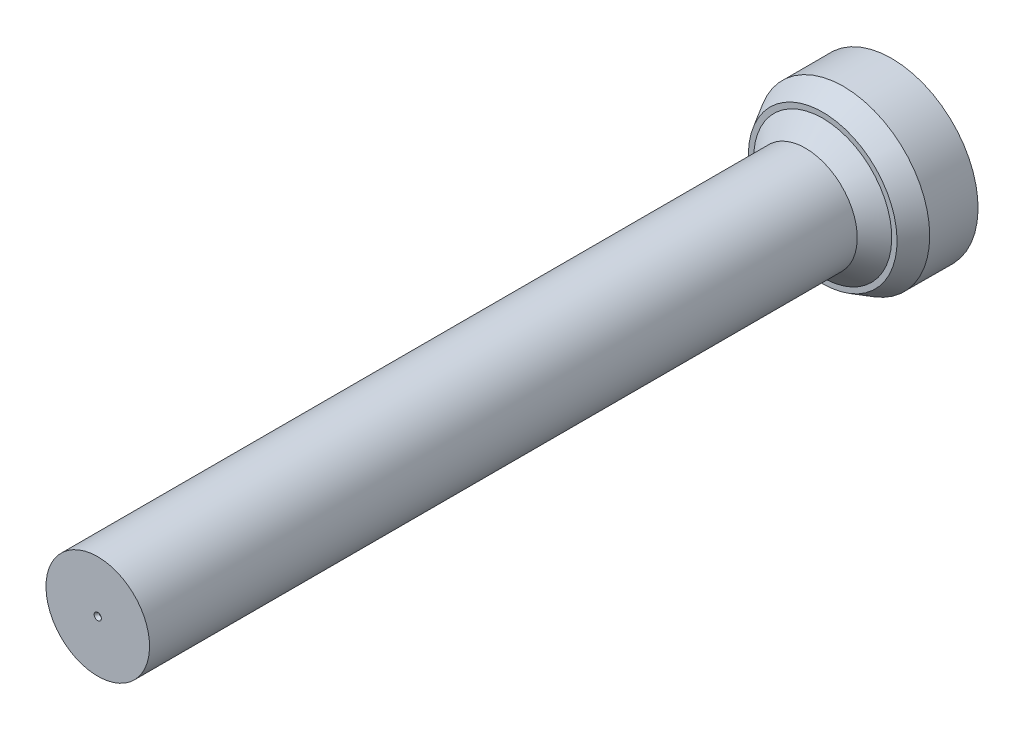
ISO-10303-21;
HEADER;
FILE_DESCRIPTION(('STEP AP214'),'2;1');
FILE_NAME('part.step','',(''),(''),'','','');
FILE_SCHEMA(('AUTOMOTIVE_DESIGN { 1 0 10303 214 1 1 1 1 }'));
ENDSEC;
DATA;
#1=APPLICATION_CONTEXT('core data for automotive mechanical design processes');
#2=APPLICATION_PROTOCOL_DEFINITION('international standard','automotive_design',2000,#1);
#3=PRODUCT_CONTEXT('',#1,'mechanical');
#4=PRODUCT('Part','Part','',(#3));
#5=PRODUCT_RELATED_PRODUCT_CATEGORY('part','',(#4));
#6=PRODUCT_DEFINITION_FORMATION('','',#4);
#7=PRODUCT_DEFINITION_CONTEXT('part definition',#1,'design');
#8=PRODUCT_DEFINITION('design','',#6,#7);
#9=PRODUCT_DEFINITION_SHAPE('','',#8);
#10=(LENGTH_UNIT() NAMED_UNIT(*) SI_UNIT(.MILLI.,.METRE.));
#11=(NAMED_UNIT(*) PLANE_ANGLE_UNIT() SI_UNIT($,.RADIAN.));
#12=(NAMED_UNIT(*) SI_UNIT($,.STERADIAN.) SOLID_ANGLE_UNIT());
#13=UNCERTAINTY_MEASURE_WITH_UNIT(LENGTH_MEASURE(1.E-05),#10,'distance_accuracy_value','');
#14=(GEOMETRIC_REPRESENTATION_CONTEXT(3) GLOBAL_UNCERTAINTY_ASSIGNED_CONTEXT((#13)) GLOBAL_UNIT_ASSIGNED_CONTEXT((#10,
#11,#12)) REPRESENTATION_CONTEXT('',''));
#15=CARTESIAN_POINT('',(0.,0.,0.));
#16=DIRECTION('',(0.,0.,1.));
#17=DIRECTION('',(1.,0.,0.));
#18=AXIS2_PLACEMENT_3D('',#15,#16,#17);
#19=CARTESIAN_POINT('',(0.,15.,115.));
#20=DIRECTION('',(0.,0.,1.));
#21=DIRECTION('',(0.,-1.,0.));
#22=AXIS2_PLACEMENT_3D('',#19,#20,#21);
#23=PLANE('',#22);
#24=CARTESIAN_POINT('',(0.,0.,115.));
#25=DIRECTION('',(0.,0.,-1.));
#26=DIRECTION('',(0.,1.,0.));
#27=AXIS2_PLACEMENT_3D('',#24,#25,#26);
#28=CIRCLE('',#27,15.);
#29=CARTESIAN_POINT('',(0.,15.,115.));
#30=VERTEX_POINT('',#29);
#31=EDGE_CURVE('E102',#30,#30,#28,.T.);
#32=ORIENTED_EDGE('',*,*,#31,.F.);
#33=EDGE_LOOP('',(#32));
#34=FACE_BOUND('',#33,.T.);
#35=CARTESIAN_POINT('',(0.,0.,115.));
#36=DIRECTION('',(0.,0.,1.));
#37=DIRECTION('',(1.,0.,0.));
#38=AXIS2_PLACEMENT_3D('',#35,#36,#37);
#39=CIRCLE('',#38,1.06);
#40=CARTESIAN_POINT('',(1.06,0.,115.));
#41=VERTEX_POINT('',#40);
#42=EDGE_CURVE('E108',#41,#41,#39,.T.);
#43=ORIENTED_EDGE('',*,*,#42,.F.);
#44=EDGE_LOOP('',(#43));
#45=FACE_BOUND('',#44,.T.);
#46=ADVANCED_FACE('F37',(#34,#45),#23,.T.);
#47=CARTESIAN_POINT('',(0.,0.,-115.));
#48=DIRECTION('',(0.,0.,-1.));
#49=DIRECTION('',(0.,1.,0.));
#50=AXIS2_PLACEMENT_3D('',#47,#48,#49);
#51=PLANE('',#50);
#52=CARTESIAN_POINT('',(0.,0.,-115.));
#53=DIRECTION('',(0.,0.,-1.));
#54=DIRECTION('',(0.,1.,0.));
#55=AXIS2_PLACEMENT_3D('',#52,#53,#54);
#56=CIRCLE('',#55,25.);
#57=CARTESIAN_POINT('',(0.,25.,-115.));
#58=VERTEX_POINT('',#57);
#59=EDGE_CURVE('E93',#58,#58,#56,.T.);
#60=ORIENTED_EDGE('',*,*,#59,.T.);
#61=EDGE_LOOP('',(#60));
#62=FACE_BOUND('',#61,.T.);
#63=ADVANCED_FACE('F60',(#62),#51,.T.);
#64=CARTESIAN_POINT('',(0.,0.,-115.));
#65=DIRECTION('',(0.,0.,-1.));
#66=DIRECTION('',(0.,1.,0.));
#67=AXIS2_PLACEMENT_3D('',#64,#65,#66);
#68=CYLINDRICAL_SURFACE('',#67,25.);
#69=CARTESIAN_POINT('',(0.,0.,-101.));
#70=DIRECTION('',(0.,0.,1.));
#71=DIRECTION('',(0.,-1.,0.));
#72=AXIS2_PLACEMENT_3D('',#69,#70,#71);
#73=CIRCLE('',#72,25.);
#74=CARTESIAN_POINT('',(0.,-24.9999999999999,-101.));
#75=VERTEX_POINT('',#74);
#76=EDGE_CURVE('E44',#75,#75,#73,.F.);
#77=ORIENTED_EDGE('',*,*,#76,.T.);
#78=EDGE_LOOP('',(#77));
#79=FACE_BOUND('',#78,.T.);
#80=ORIENTED_EDGE('',*,*,#59,.F.);
#81=EDGE_LOOP('',(#80));
#82=FACE_BOUND('',#81,.T.);
#83=ADVANCED_FACE('F66',(#79,#82),#68,.T.);
#84=CARTESIAN_POINT('',(0.,25.,-95.));
#85=DIRECTION('',(0.,0.,1.));
#86=DIRECTION('',(0.,-1.,0.));
#87=AXIS2_PLACEMENT_3D('',#84,#85,#86);
#88=PLANE('',#87);
#89=CARTESIAN_POINT('',(0.,0.,-95.));
#90=DIRECTION('',(0.,0.,1.));
#91=DIRECTION('',(0.,-1.,0.));
#92=AXIS2_PLACEMENT_3D('',#89,#90,#91);
#93=CIRCLE('',#92,21.5358983848623);
#94=CARTESIAN_POINT('',(0.,-21.5358983848622,-95.));
#95=VERTEX_POINT('',#94);
#96=EDGE_CURVE('E11',#95,#95,#93,.T.);
#97=ORIENTED_EDGE('',*,*,#96,.T.);
#98=EDGE_LOOP('',(#97));
#99=FACE_BOUND('',#98,.T.);
#100=CARTESIAN_POINT('',(0.,0.,-95.));
#101=DIRECTION('',(0.,0.,-1.));
#102=DIRECTION('',(0.,1.,0.));
#103=AXIS2_PLACEMENT_3D('',#100,#101,#102);
#104=CIRCLE('',#103,20.);
#105=CARTESIAN_POINT('',(0.,20.,-95.));
#106=VERTEX_POINT('',#105);
#107=EDGE_CURVE('E94',#106,#106,#104,.T.);
#108=ORIENTED_EDGE('',*,*,#107,.T.);
#109=EDGE_LOOP('',(#108));
#110=FACE_BOUND('',#109,.T.);
#111=ADVANCED_FACE('F79',(#99,#110),#88,.T.);
#112=CARTESIAN_POINT('',(0.,0.,-95.));
#113=DIRECTION('',(0.,0.,-1.));
#114=DIRECTION('',(0.,1.,0.));
#115=AXIS2_PLACEMENT_3D('',#112,#113,#114);
#116=CONICAL_SURFACE('',#115,20.,0.785398163397447);
#117=CARTESIAN_POINT('',(0.,0.,-90.));
#118=DIRECTION('',(0.,0.,-1.));
#119=DIRECTION('',(0.,1.,0.));
#120=AXIS2_PLACEMENT_3D('',#117,#118,#119);
#121=CIRCLE('',#120,15.);
#122=CARTESIAN_POINT('',(0.,15.,-90.));
#123=VERTEX_POINT('',#122);
#124=EDGE_CURVE('E97',#123,#123,#121,.T.);
#125=ORIENTED_EDGE('',*,*,#124,.T.);
#126=EDGE_LOOP('',(#125));
#127=FACE_BOUND('',#126,.T.);
#128=ORIENTED_EDGE('',*,*,#107,.F.);
#129=EDGE_LOOP('',(#128));
#130=FACE_BOUND('',#129,.T.);
#131=ADVANCED_FACE('F75',(#127,#130),#116,.T.);
#132=CARTESIAN_POINT('',(0.,0.,-115.));
#133=DIRECTION('',(0.,0.,-1.));
#134=DIRECTION('',(0.,1.,0.));
#135=AXIS2_PLACEMENT_3D('',#132,#133,#134);
#136=CYLINDRICAL_SURFACE('',#135,15.);
#137=ORIENTED_EDGE('',*,*,#31,.T.);
#138=EDGE_LOOP('',(#137));
#139=FACE_BOUND('',#138,.T.);
#140=ORIENTED_EDGE('',*,*,#124,.F.);
#141=EDGE_LOOP('',(#140));
#142=FACE_BOUND('',#141,.T.);
#143=ADVANCED_FACE('F72',(#139,#142),#136,.T.);
#144=CARTESIAN_POINT('',(0.,0.,-101.));
#145=DIRECTION('',(0.,0.,-1.));
#146=DIRECTION('',(0.,1.,0.));
#147=AXIS2_PLACEMENT_3D('',#144,#145,#146);
#148=CONICAL_SURFACE('',#147,25.,0.523598775598297);
#149=ORIENTED_EDGE('',*,*,#96,.F.);
#150=EDGE_LOOP('',(#149));
#151=FACE_BOUND('',#150,.T.);
#152=ORIENTED_EDGE('',*,*,#76,.F.);
#153=EDGE_LOOP('',(#152));
#154=FACE_BOUND('',#153,.T.);
#155=ADVANCED_FACE('F39',(#151,#154),#148,.T.);
#156=CARTESIAN_POINT('',(0.,0.,115.));
#157=DIRECTION('',(0.,0.,1.));
#158=DIRECTION('',(1.,0.,0.));
#159=AXIS2_PLACEMENT_3D('',#156,#157,#158);
#160=CYLINDRICAL_SURFACE('',#159,0.5);
#161=CARTESIAN_POINT('',(0.,0.,114.030051547761));
#162=DIRECTION('',(0.,0.,1.));
#163=DIRECTION('',(1.,0.,0.));
#164=AXIS2_PLACEMENT_3D('',#161,#162,#163);
#165=CIRCLE('',#164,0.5);
#166=CARTESIAN_POINT('',(0.5,0.,114.030051547761));
#167=VERTEX_POINT('',#166);
#168=EDGE_CURVE('E105',#167,#167,#165,.T.);
#169=ORIENTED_EDGE('',*,*,#168,.T.);
#170=EDGE_LOOP('',(#169));
#171=FACE_BOUND('',#170,.T.);
#172=CARTESIAN_POINT('',(0.,0.,113.1));
#173=DIRECTION('',(0.,0.,1.));
#174=DIRECTION('',(1.,0.,0.));
#175=AXIS2_PLACEMENT_3D('',#172,#173,#174);
#176=CIRCLE('',#175,0.499999999999999);
#177=CARTESIAN_POINT('',(0.5,0.,113.1));
#178=VERTEX_POINT('',#177);
#179=EDGE_CURVE('E111',#178,#178,#176,.T.);
#180=ORIENTED_EDGE('',*,*,#179,.F.);
#181=EDGE_LOOP('',(#180));
#182=FACE_BOUND('',#181,.T.);
#183=ADVANCED_FACE('F55',(#171,#182),#160,.F.);
#184=CARTESIAN_POINT('',(0.,0.,114.030051547761));
#185=DIRECTION('',(0.,0.,1.));
#186=DIRECTION('',(1.,0.,0.));
#187=AXIS2_PLACEMENT_3D('',#184,#185,#186);
#188=CONICAL_SURFACE('',#187,0.5,0.523598775598296);
#189=ORIENTED_EDGE('',*,*,#42,.T.);
#190=EDGE_LOOP('',(#189));
#191=FACE_BOUND('',#190,.T.);
#192=ORIENTED_EDGE('',*,*,#168,.F.);
#193=EDGE_LOOP('',(#192));
#194=FACE_BOUND('',#193,.T.);
#195=ADVANCED_FACE('F49',(#191,#194),#188,.F.);
#196=CARTESIAN_POINT('',(0.,0.,112.799569690486));
#197=DIRECTION('',(0.,0.,1.));
#198=DIRECTION('',(1.,0.,0.));
#199=AXIS2_PLACEMENT_3D('',#196,#197,#198);
#200=CONICAL_SURFACE('',#199,0.,1.02974425867665);
#201=ORIENTED_EDGE('',*,*,#179,.T.);
#202=EDGE_LOOP('',(#201));
#203=FACE_BOUND('',#202,.T.);
#204=CARTESIAN_POINT('',(0.,0.,112.799569690486));
#205=VERTEX_POINT('',#204);
#206=VERTEX_LOOP('',#205);
#207=FACE_BOUND('',#206,.T.);
#208=ADVANCED_FACE('F47',(#203,#207),#200,.F.);
#209=CLOSED_SHELL('',(#46,#63,#83,#111,#131,#143,#155,#183,#195,#208));
#210=MANIFOLD_SOLID_BREP('B2',#209);
#211=ADVANCED_BREP_SHAPE_REPRESENTATION('',(#18,#210),#14);
#212=SHAPE_DEFINITION_REPRESENTATION(#9,#211);
ENDSEC;
END-ISO-10303-21;
